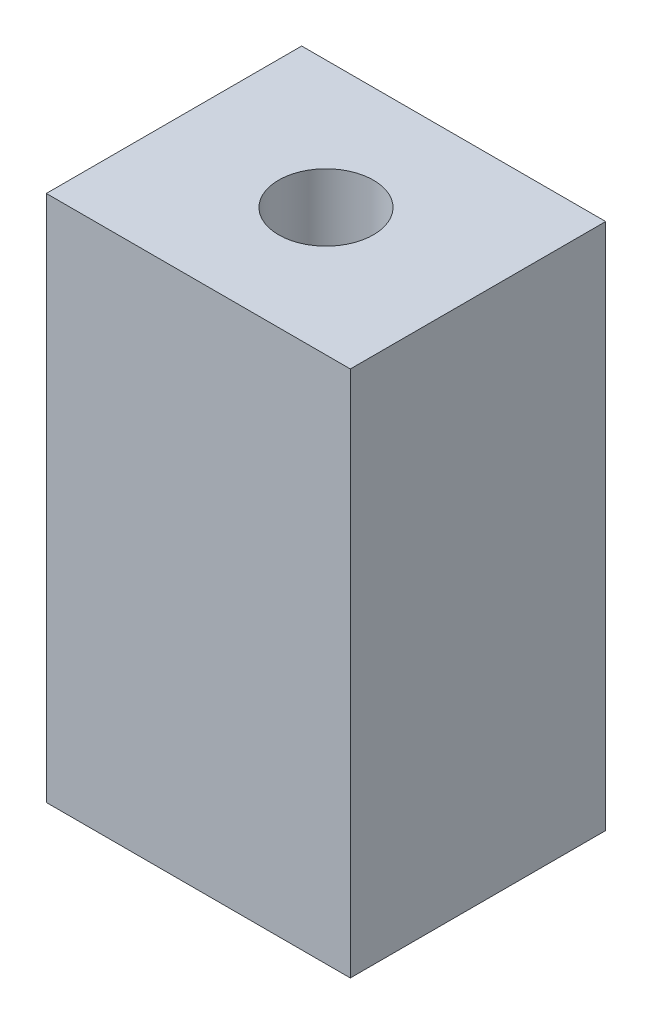
ISO-10303-21;
HEADER;
FILE_DESCRIPTION(('STEP AP214'),'2;1');
FILE_NAME('part.step','',(''),(''),'','','');
FILE_SCHEMA(('AUTOMOTIVE_DESIGN { 1 0 10303 214 1 1 1 1 }'));
ENDSEC;
DATA;
#1=APPLICATION_CONTEXT('core data for automotive mechanical design processes');
#2=APPLICATION_PROTOCOL_DEFINITION('international standard','automotive_design',2000,#1);
#3=PRODUCT_CONTEXT('',#1,'mechanical');
#4=PRODUCT('Part','Part','',(#3));
#5=PRODUCT_RELATED_PRODUCT_CATEGORY('part','',(#4));
#6=PRODUCT_DEFINITION_FORMATION('','',#4);
#7=PRODUCT_DEFINITION_CONTEXT('part definition',#1,'design');
#8=PRODUCT_DEFINITION('design','',#6,#7);
#9=PRODUCT_DEFINITION_SHAPE('','',#8);
#10=(LENGTH_UNIT() NAMED_UNIT(*) SI_UNIT(.MILLI.,.METRE.));
#11=(NAMED_UNIT(*) PLANE_ANGLE_UNIT() SI_UNIT($,.RADIAN.));
#12=(NAMED_UNIT(*) SI_UNIT($,.STERADIAN.) SOLID_ANGLE_UNIT());
#13=UNCERTAINTY_MEASURE_WITH_UNIT(LENGTH_MEASURE(1.E-05),#10,'distance_accuracy_value','');
#14=(GEOMETRIC_REPRESENTATION_CONTEXT(3) GLOBAL_UNCERTAINTY_ASSIGNED_CONTEXT((#13)) GLOBAL_UNIT_ASSIGNED_CONTEXT((#10,
#11,#12)) REPRESENTATION_CONTEXT('',''));
#15=CARTESIAN_POINT('',(0.,0.,0.));
#16=DIRECTION('',(0.,0.,1.));
#17=DIRECTION('',(1.,0.,0.));
#18=AXIS2_PLACEMENT_3D('',#15,#16,#17);
#19=CARTESIAN_POINT('',(0.,44.069,0.));
#20=DIRECTION('',(0.,1.,0.));
#21=DIRECTION('',(0.,0.,1.));
#22=AXIS2_PLACEMENT_3D('',#19,#20,#21);
#23=PLANE('',#22);
#24=DIRECTION('',(0.,0.,1.));
#25=VECTOR('',#24,1.);
#26=CARTESIAN_POINT('',(0.,44.069,0.));
#27=LINE('',#26,#25);
#28=CARTESIAN_POINT('',(0.,44.069,0.));
#29=VERTEX_POINT('',#28);
#30=CARTESIAN_POINT('',(0.,44.069,21.336));
#31=VERTEX_POINT('',#30);
#32=EDGE_CURVE('E84',#29,#31,#27,.T.);
#33=ORIENTED_EDGE('',*,*,#32,.T.);
#34=DIRECTION('',(1.,0.,0.));
#35=VECTOR('',#34,1.);
#36=CARTESIAN_POINT('',(0.,44.069,21.336));
#37=LINE('',#36,#35);
#38=CARTESIAN_POINT('',(25.4,44.069,21.336));
#39=VERTEX_POINT('',#38);
#40=EDGE_CURVE('E79',#31,#39,#37,.T.);
#41=ORIENTED_EDGE('',*,*,#40,.T.);
#42=DIRECTION('',(0.,0.,-1.));
#43=VECTOR('',#42,1.);
#44=CARTESIAN_POINT('',(25.4,44.069,0.));
#45=LINE('',#44,#43);
#46=CARTESIAN_POINT('',(25.4,44.069,0.));
#47=VERTEX_POINT('',#46);
#48=EDGE_CURVE('E82',#39,#47,#45,.T.);
#49=ORIENTED_EDGE('',*,*,#48,.T.);
#50=DIRECTION('',(-1.,0.,0.));
#51=VECTOR('',#50,1.);
#52=CARTESIAN_POINT('',(0.,44.069,0.));
#53=LINE('',#52,#51);
#54=EDGE_CURVE('E49',#47,#29,#53,.T.);
#55=ORIENTED_EDGE('',*,*,#54,.T.);
#56=EDGE_LOOP('',(#33,#41,#49,#55));
#57=FACE_BOUND('',#56,.T.);
#58=CARTESIAN_POINT('',(12.7,44.069,10.668));
#59=DIRECTION('',(0.,1.,0.));
#60=DIRECTION('',(0.,0.,1.));
#61=AXIS2_PLACEMENT_3D('',#58,#59,#60);
#62=CIRCLE('',#61,3.9624);
#63=CARTESIAN_POINT('',(12.7,44.069,14.6304));
#64=VERTEX_POINT('',#63);
#65=EDGE_CURVE('E99',#64,#64,#62,.T.);
#66=ORIENTED_EDGE('',*,*,#65,.F.);
#67=EDGE_LOOP('',(#66));
#68=FACE_BOUND('',#67,.T.);
#69=ADVANCED_FACE('F32',(#57,#68),#23,.T.);
#70=CARTESIAN_POINT('',(0.,0.,0.));
#71=DIRECTION('',(0.,1.,0.));
#72=DIRECTION('',(0.,0.,1.));
#73=AXIS2_PLACEMENT_3D('',#70,#71,#72);
#74=PLANE('',#73);
#75=DIRECTION('',(0.,0.,1.));
#76=VECTOR('',#75,1.);
#77=CARTESIAN_POINT('',(0.,0.,0.));
#78=LINE('',#77,#76);
#79=CARTESIAN_POINT('',(0.,0.,0.));
#80=VERTEX_POINT('',#79);
#81=CARTESIAN_POINT('',(0.,0.,21.336));
#82=VERTEX_POINT('',#81);
#83=EDGE_CURVE('E96',#80,#82,#78,.T.);
#84=ORIENTED_EDGE('',*,*,#83,.F.);
#85=DIRECTION('',(-1.,0.,0.));
#86=VECTOR('',#85,1.);
#87=CARTESIAN_POINT('',(0.,0.,0.));
#88=LINE('',#87,#86);
#89=CARTESIAN_POINT('',(25.4,0.,0.));
#90=VERTEX_POINT('',#89);
#91=EDGE_CURVE('E72',#90,#80,#88,.T.);
#92=ORIENTED_EDGE('',*,*,#91,.F.);
#93=DIRECTION('',(0.,0.,-1.));
#94=VECTOR('',#93,1.);
#95=CARTESIAN_POINT('',(25.4,0.,0.));
#96=LINE('',#95,#94);
#97=CARTESIAN_POINT('',(25.4,0.,21.336));
#98=VERTEX_POINT('',#97);
#99=EDGE_CURVE('E66',#98,#90,#96,.T.);
#100=ORIENTED_EDGE('',*,*,#99,.F.);
#101=DIRECTION('',(1.,0.,0.));
#102=VECTOR('',#101,1.);
#103=CARTESIAN_POINT('',(0.,0.,21.336));
#104=LINE('',#103,#102);
#105=EDGE_CURVE('E88',#82,#98,#104,.T.);
#106=ORIENTED_EDGE('',*,*,#105,.F.);
#107=EDGE_LOOP('',(#84,#92,#100,#106));
#108=FACE_BOUND('',#107,.T.);
#109=CARTESIAN_POINT('',(12.7,0.,10.668));
#110=DIRECTION('',(0.,1.,0.));
#111=DIRECTION('',(0.,0.,1.));
#112=AXIS2_PLACEMENT_3D('',#109,#110,#111);
#113=CIRCLE('',#112,3.9624);
#114=CARTESIAN_POINT('',(12.7,0.,14.6304));
#115=VERTEX_POINT('',#114);
#116=EDGE_CURVE('E111',#115,#115,#113,.T.);
#117=ORIENTED_EDGE('',*,*,#116,.T.);
#118=EDGE_LOOP('',(#117));
#119=FACE_BOUND('',#118,.T.);
#120=ADVANCED_FACE('F107',(#108,#119),#74,.F.);
#121=CARTESIAN_POINT('',(0.,44.069,0.));
#122=DIRECTION('',(1.,0.,0.));
#123=DIRECTION('',(0.,0.,-1.));
#124=AXIS2_PLACEMENT_3D('',#121,#122,#123);
#125=PLANE('',#124);
#126=CARTESIAN_POINT('',(0.,19.558,5.1562));
#127=DIRECTION('',(-1.,0.,0.));
#128=DIRECTION('',(0.,0.,1.));
#129=AXIS2_PLACEMENT_3D('',#126,#127,#128);
#130=CIRCLE('',#129,2.286);
#131=CARTESIAN_POINT('',(0.,19.558,7.4422));
#132=VERTEX_POINT('',#131);
#133=EDGE_CURVE('E123',#132,#132,#130,.T.);
#134=ORIENTED_EDGE('',*,*,#133,.F.);
#135=EDGE_LOOP('',(#134));
#136=FACE_BOUND('',#135,.T.);
#137=CARTESIAN_POINT('',(0.,32.258,16.1798));
#138=DIRECTION('',(-1.,0.,0.));
#139=DIRECTION('',(0.,0.,1.));
#140=AXIS2_PLACEMENT_3D('',#137,#138,#139);
#141=CIRCLE('',#140,2.286);
#142=CARTESIAN_POINT('',(0.,32.258,18.4658));
#143=VERTEX_POINT('',#142);
#144=EDGE_CURVE('E117',#143,#143,#141,.T.);
#145=ORIENTED_EDGE('',*,*,#144,.F.);
#146=EDGE_LOOP('',(#145));
#147=FACE_BOUND('',#146,.T.);
#148=ORIENTED_EDGE('',*,*,#83,.T.);
#149=DIRECTION('',(0.,-1.,0.));
#150=VECTOR('',#149,1.);
#151=CARTESIAN_POINT('',(0.,44.069,21.336));
#152=LINE('',#151,#150);
#153=EDGE_CURVE('E11',#31,#82,#152,.T.);
#154=ORIENTED_EDGE('',*,*,#153,.F.);
#155=ORIENTED_EDGE('',*,*,#32,.F.);
#156=DIRECTION('',(0.,-1.,0.));
#157=VECTOR('',#156,1.);
#158=CARTESIAN_POINT('',(0.,44.069,0.));
#159=LINE('',#158,#157);
#160=EDGE_CURVE('E92',#29,#80,#159,.T.);
#161=ORIENTED_EDGE('',*,*,#160,.T.);
#162=EDGE_LOOP('',(#148,#154,#155,#161));
#163=FACE_BOUND('',#162,.T.);
#164=ADVANCED_FACE('F34',(#136,#147,#163),#125,.F.);
#165=CARTESIAN_POINT('',(0.,44.069,21.336));
#166=DIRECTION('',(0.,0.,-1.));
#167=DIRECTION('',(-1.,0.,0.));
#168=AXIS2_PLACEMENT_3D('',#165,#166,#167);
#169=PLANE('',#168);
#170=ORIENTED_EDGE('',*,*,#105,.T.);
#171=DIRECTION('',(0.,-1.,0.));
#172=VECTOR('',#171,1.);
#173=CARTESIAN_POINT('',(25.4,44.069,21.336));
#174=LINE('',#173,#172);
#175=EDGE_CURVE('E41',#39,#98,#174,.T.);
#176=ORIENTED_EDGE('',*,*,#175,.F.);
#177=ORIENTED_EDGE('',*,*,#40,.F.);
#178=ORIENTED_EDGE('',*,*,#153,.T.);
#179=EDGE_LOOP('',(#170,#176,#177,#178));
#180=FACE_BOUND('',#179,.T.);
#181=ADVANCED_FACE('F87',(#180),#169,.F.);
#182=CARTESIAN_POINT('',(25.4,44.069,0.));
#183=DIRECTION('',(-1.,0.,0.));
#184=DIRECTION('',(0.,0.,1.));
#185=AXIS2_PLACEMENT_3D('',#182,#183,#184);
#186=PLANE('',#185);
#187=ORIENTED_EDGE('',*,*,#99,.T.);
#188=DIRECTION('',(0.,-1.,0.));
#189=VECTOR('',#188,1.);
#190=CARTESIAN_POINT('',(25.4,44.069,0.));
#191=LINE('',#190,#189);
#192=EDGE_CURVE('E89',#47,#90,#191,.T.);
#193=ORIENTED_EDGE('',*,*,#192,.F.);
#194=ORIENTED_EDGE('',*,*,#48,.F.);
#195=ORIENTED_EDGE('',*,*,#175,.T.);
#196=EDGE_LOOP('',(#187,#193,#194,#195));
#197=FACE_BOUND('',#196,.T.);
#198=ADVANCED_FACE('F90',(#197),#186,.F.);
#199=CARTESIAN_POINT('',(0.,44.069,0.));
#200=DIRECTION('',(0.,0.,1.));
#201=DIRECTION('',(1.,0.,0.));
#202=AXIS2_PLACEMENT_3D('',#199,#200,#201);
#203=PLANE('',#202);
#204=ORIENTED_EDGE('',*,*,#91,.T.);
#205=ORIENTED_EDGE('',*,*,#160,.F.);
#206=ORIENTED_EDGE('',*,*,#54,.F.);
#207=ORIENTED_EDGE('',*,*,#192,.T.);
#208=EDGE_LOOP('',(#204,#205,#206,#207));
#209=FACE_BOUND('',#208,.T.);
#210=ADVANCED_FACE('F104',(#209),#203,.F.);
#211=CARTESIAN_POINT('',(12.7,44.069,10.668));
#212=DIRECTION('',(0.,-1.,0.));
#213=DIRECTION('',(0.,0.,-1.));
#214=AXIS2_PLACEMENT_3D('',#211,#212,#213);
#215=CYLINDRICAL_SURFACE('',#214,3.9624);
#216=ORIENTED_EDGE('',*,*,#65,.T.);
#217=EDGE_LOOP('',(#216));
#218=FACE_BOUND('',#217,.T.);
#219=ORIENTED_EDGE('',*,*,#116,.F.);
#220=EDGE_LOOP('',(#219));
#221=FACE_BOUND('',#220,.T.);
#222=ADVANCED_FACE('F144',(#218,#221),#215,.F.);
#223=CARTESIAN_POINT('',(3.175,32.258,16.1798));
#224=DIRECTION('',(-1.,0.,0.));
#225=DIRECTION('',(0.,0.,1.));
#226=AXIS2_PLACEMENT_3D('',#223,#224,#225);
#227=CYLINDRICAL_SURFACE('',#226,2.286);
#228=CARTESIAN_POINT('',(3.175,32.258,16.1798));
#229=DIRECTION('',(-1.,0.,0.));
#230=DIRECTION('',(0.,0.,1.));
#231=AXIS2_PLACEMENT_3D('',#228,#229,#230);
#232=CIRCLE('',#231,2.286);
#233=CARTESIAN_POINT('',(3.175,32.258,18.4658));
#234=VERTEX_POINT('',#233);
#235=EDGE_CURVE('E114',#234,#234,#232,.T.);
#236=ORIENTED_EDGE('',*,*,#235,.F.);
#237=EDGE_LOOP('',(#236));
#238=FACE_BOUND('',#237,.T.);
#239=ORIENTED_EDGE('',*,*,#144,.T.);
#240=EDGE_LOOP('',(#239));
#241=FACE_BOUND('',#240,.T.);
#242=ADVANCED_FACE('F142',(#238,#241),#227,.F.);
#243=CARTESIAN_POINT('',(3.175,32.258,16.1798));
#244=DIRECTION('',(-1.,0.,0.));
#245=DIRECTION('',(0.,0.,1.));
#246=AXIS2_PLACEMENT_3D('',#243,#244,#245);
#247=PLANE('',#246);
#248=ORIENTED_EDGE('',*,*,#235,.T.);
#249=EDGE_LOOP('',(#248));
#250=FACE_BOUND('',#249,.T.);
#251=ADVANCED_FACE('F134',(#250),#247,.T.);
#252=CARTESIAN_POINT('',(3.175,19.558,5.1562));
#253=DIRECTION('',(-1.,0.,0.));
#254=DIRECTION('',(0.,0.,1.));
#255=AXIS2_PLACEMENT_3D('',#252,#253,#254);
#256=CYLINDRICAL_SURFACE('',#255,2.286);
#257=CARTESIAN_POINT('',(3.175,19.558,5.1562));
#258=DIRECTION('',(-1.,0.,0.));
#259=DIRECTION('',(0.,0.,1.));
#260=AXIS2_PLACEMENT_3D('',#257,#258,#259);
#261=CIRCLE('',#260,2.286);
#262=CARTESIAN_POINT('',(3.175,19.558,7.4422));
#263=VERTEX_POINT('',#262);
#264=EDGE_CURVE('E120',#263,#263,#261,.T.);
#265=ORIENTED_EDGE('',*,*,#264,.F.);
#266=EDGE_LOOP('',(#265));
#267=FACE_BOUND('',#266,.T.);
#268=ORIENTED_EDGE('',*,*,#133,.T.);
#269=EDGE_LOOP('',(#268));
#270=FACE_BOUND('',#269,.T.);
#271=ADVANCED_FACE('F131',(#267,#270),#256,.F.);
#272=CARTESIAN_POINT('',(3.175,19.558,5.1562));
#273=DIRECTION('',(-1.,0.,0.));
#274=DIRECTION('',(0.,0.,1.));
#275=AXIS2_PLACEMENT_3D('',#272,#273,#274);
#276=PLANE('',#275);
#277=ORIENTED_EDGE('',*,*,#264,.T.);
#278=EDGE_LOOP('',(#277));
#279=FACE_BOUND('',#278,.T.);
#280=ADVANCED_FACE('F129',(#279),#276,.T.);
#281=CLOSED_SHELL('',(#69,#120,#164,#181,#198,#210,#222,#242,#251,#271,#280));
#282=MANIFOLD_SOLID_BREP('B2',#281);
#283=ADVANCED_BREP_SHAPE_REPRESENTATION('',(#18,#282),#14);
#284=SHAPE_DEFINITION_REPRESENTATION(#9,#283);
ENDSEC;
END-ISO-10303-21;
